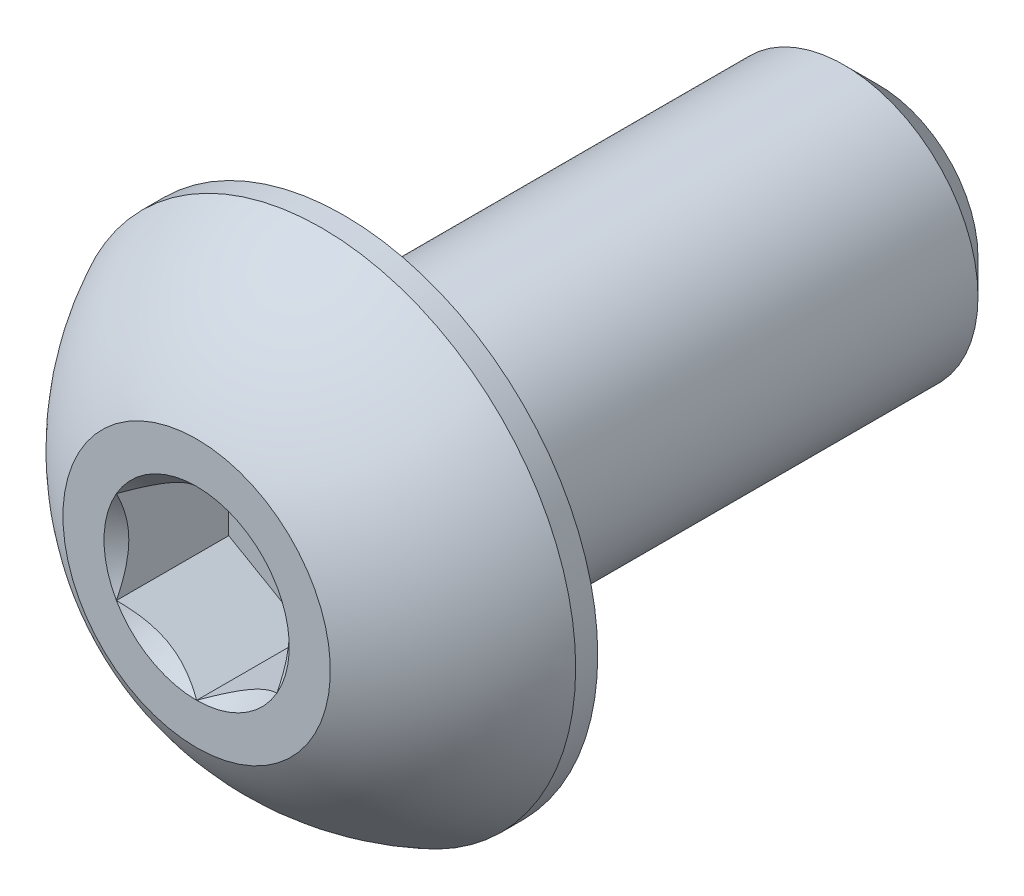
ISO-10303-21;
HEADER;
FILE_DESCRIPTION(('STEP AP214'),'2;1');
FILE_NAME('part.step','',(''),(''),'','','');
FILE_SCHEMA(('AUTOMOTIVE_DESIGN { 1 0 10303 214 1 1 1 1 }'));
ENDSEC;
DATA;
#1=APPLICATION_CONTEXT('core data for automotive mechanical design processes');
#2=APPLICATION_PROTOCOL_DEFINITION('international standard','automotive_design',2000,#1);
#3=PRODUCT_CONTEXT('',#1,'mechanical');
#4=PRODUCT('Part','Part','',(#3));
#5=PRODUCT_RELATED_PRODUCT_CATEGORY('part','',(#4));
#6=PRODUCT_DEFINITION_FORMATION('','',#4);
#7=PRODUCT_DEFINITION_CONTEXT('part definition',#1,'design');
#8=PRODUCT_DEFINITION('design','',#6,#7);
#9=PRODUCT_DEFINITION_SHAPE('','',#8);
#10=(LENGTH_UNIT() NAMED_UNIT(*) SI_UNIT(.MILLI.,.METRE.));
#11=(NAMED_UNIT(*) PLANE_ANGLE_UNIT() SI_UNIT($,.RADIAN.));
#12=(NAMED_UNIT(*) SI_UNIT($,.STERADIAN.) SOLID_ANGLE_UNIT());
#13=UNCERTAINTY_MEASURE_WITH_UNIT(LENGTH_MEASURE(1.E-05),#10,'distance_accuracy_value','');
#14=(GEOMETRIC_REPRESENTATION_CONTEXT(3) GLOBAL_UNCERTAINTY_ASSIGNED_CONTEXT((#13)) GLOBAL_UNIT_ASSIGNED_CONTEXT((#10,
#11,#12)) REPRESENTATION_CONTEXT('',''));
#15=CARTESIAN_POINT('',(0.,0.,0.));
#16=DIRECTION('',(0.,0.,1.));
#17=DIRECTION('',(1.,0.,0.));
#18=AXIS2_PLACEMENT_3D('',#15,#16,#17);
#19=CARTESIAN_POINT('',(0.,0.,6.375));
#20=DIRECTION('',(0.,0.,-1.));
#21=DIRECTION('',(-1.,0.,0.));
#22=AXIS2_PLACEMENT_3D('',#19,#20,#21);
#23=PLANE('',#22);
#24=CARTESIAN_POINT('',(0.,0.,6.375));
#25=DIRECTION('',(0.,0.,1.));
#26=DIRECTION('',(1.,0.,0.));
#27=AXIS2_PLACEMENT_3D('',#24,#25,#26);
#28=CIRCLE('',#27,1.73205080756888);
#29=CARTESIAN_POINT('',(-1.5,0.86602540378444,6.375));
#30=VERTEX_POINT('',#29);
#31=CARTESIAN_POINT('',(-1.5,-0.866025403784439,6.375));
#32=VERTEX_POINT('',#31);
#33=EDGE_CURVE('E138',#30,#32,#28,.T.);
#34=ORIENTED_EDGE('',*,*,#33,.F.);
#35=CARTESIAN_POINT('',(0.,1.73205080756888,6.375));
#36=VERTEX_POINT('',#35);
#37=EDGE_CURVE('E108',#36,#30,#28,.T.);
#38=ORIENTED_EDGE('',*,*,#37,.F.);
#39=CARTESIAN_POINT('',(1.5,0.866025403784441,6.375));
#40=VERTEX_POINT('',#39);
#41=EDGE_CURVE('E98',#40,#36,#28,.T.);
#42=ORIENTED_EDGE('',*,*,#41,.F.);
#43=CARTESIAN_POINT('',(1.5,-0.86602540378444,6.375));
#44=VERTEX_POINT('',#43);
#45=EDGE_CURVE('E59',#44,#40,#28,.T.);
#46=ORIENTED_EDGE('',*,*,#45,.F.);
#47=CARTESIAN_POINT('',(0.,-1.73205080756888,6.375));
#48=VERTEX_POINT('',#47);
#49=EDGE_CURVE('E66',#48,#44,#28,.T.);
#50=ORIENTED_EDGE('',*,*,#49,.F.);
#51=EDGE_CURVE('E141',#32,#48,#28,.T.);
#52=ORIENTED_EDGE('',*,*,#51,.F.);
#53=EDGE_LOOP('',(#34,#38,#42,#46,#50,#52));
#54=FACE_BOUND('',#53,.T.);
#55=CARTESIAN_POINT('',(0.,0.,6.375));
#56=DIRECTION('',(0.,0.,1.));
#57=DIRECTION('',(1.,0.,0.));
#58=AXIS2_PLACEMENT_3D('',#55,#56,#57);
#59=CIRCLE('',#58,2.5);
#60=CARTESIAN_POINT('',(0.,2.5,6.375));
#61=VERTEX_POINT('',#60);
#62=EDGE_CURVE('E53',#61,#61,#59,.T.);
#63=ORIENTED_EDGE('',*,*,#62,.T.);
#64=EDGE_LOOP('',(#63));
#65=FACE_BOUND('',#64,.T.);
#66=ADVANCED_FACE('F39',(#54,#65),#23,.F.);
#67=CARTESIAN_POINT('',(0.,0.,1.71694518716577));
#68=DIRECTION('',(0.,0.,1.));
#69=DIRECTION('',(0.,1.,0.));
#70=AXIS2_PLACEMENT_3D('',#67,#68,#69);
#71=SPHERICAL_SURFACE('',#70,5.28653711226622);
#72=CARTESIAN_POINT('',(0.,0.,4.0375));
#73=DIRECTION('',(0.,0.,1.));
#74=DIRECTION('',(1.,0.,0.));
#75=AXIS2_PLACEMENT_3D('',#72,#73,#74);
#76=CIRCLE('',#75,4.75);
#77=CARTESIAN_POINT('',(0.,4.75,4.0375));
#78=VERTEX_POINT('',#77);
#79=EDGE_CURVE('E239',#78,#78,#76,.T.);
#80=CARTESIAN_POINT('',(0.,2.5,6.375));
#81=CARTESIAN_POINT('',(0.,2.53026679982017,6.35875571754439));
#82=CARTESIAN_POINT('',(0.,2.56037522904968,6.34221635879359));
#83=CARTESIAN_POINT('',(0.,2.62026400427657,6.30855394811781));
#84=CARTESIAN_POINT('',(0.,2.65004435027396,6.29143089619284));
#85=CARTESIAN_POINT('',(0.,2.70926561698583,6.25660755858496));
#86=CARTESIAN_POINT('',(0.,2.73870653770032,6.23890727290205));
#87=CARTESIAN_POINT('',(0.,2.79723777417103,6.20293620595505));
#88=CARTESIAN_POINT('',(0.,2.82632808992726,6.18466542469097));
#89=CARTESIAN_POINT('',(0.,2.88414706107589,6.14756030560732));
#90=CARTESIAN_POINT('',(0.,2.91287571646831,6.12872596778775));
#91=CARTESIAN_POINT('',(0.,2.96996045130293,6.09050089302141));
#92=CARTESIAN_POINT('',(0.,2.99831653074515,6.07111015607463));
#93=CARTESIAN_POINT('',(0.,3.05464533901891,6.03177965075515));
#94=CARTESIAN_POINT('',(0.,3.08261806785047,6.01183988238243));
#95=CARTESIAN_POINT('',(0.,3.13816954607726,5.97141889083541));
#96=CARTESIAN_POINT('',(0.,3.16574829547251,5.9509376676611));
#97=CARTESIAN_POINT('',(0.,3.22050133565615,5.90944154879096));
#98=CARTESIAN_POINT('',(0.,3.24767562644455,5.88842665309514));
#99=CARTESIAN_POINT('',(0.,3.30160942393942,5.84587117426481));
#100=CARTESIAN_POINT('',(0.,3.32836893064588,5.82433059113032));
#101=CARTESIAN_POINT('',(0.,3.38146299210494,5.78073192224629));
#102=CARTESIAN_POINT('',(0.,3.40779754685753,5.75867383649675));
#103=CARTESIAN_POINT('',(0.,3.46003169800773,5.71404854384449));
#104=CARTESIAN_POINT('',(0.,3.48593129440535,5.69148133694176));
#105=CARTESIAN_POINT('',(0.,3.53728568771641,5.64584637689649));
#106=CARTESIAN_POINT('',(0.,3.56274048462986,5.62277862375395));
#107=CARTESIAN_POINT('',(0.,3.61319560685493,5.57615133633622));
#108=CARTESIAN_POINT('',(0.,3.63819593216655,5.55259180206104));
#109=CARTESIAN_POINT('',(0.,3.68773261175691,5.50498990434842));
#110=CARTESIAN_POINT('',(0.,3.71226896603565,5.48094754091097));
#111=CARTESIAN_POINT('',(0.,3.76086838042534,5.43238912030588));
#112=CARTESIAN_POINT('',(0.,3.78493144053629,5.40787306313824));
#113=CARTESIAN_POINT('',(0.,3.83257512329416,5.35837657049534));
#114=CARTESIAN_POINT('',(0.,3.85615574594108,5.33339613502008));
#115=CARTESIAN_POINT('',(0.,3.90282559378753,5.2829803776354));
#116=CARTESIAN_POINT('',(0.,3.92591481898706,5.25754505572598));
#117=CARTESIAN_POINT('',(0.,3.97159309867276,5.2062291901907));
#118=CARTESIAN_POINT('',(0.,3.99418215315894,5.18034864656483));
#119=CARTESIAN_POINT('',(0.,4.03885150820303,5.12815217148626));
#120=CARTESIAN_POINT('',(0.,4.06093180876093,5.10183624003357));
#121=CARTESIAN_POINT('',(0.,4.10457526604591,5.04877898862629));
#122=CARTESIAN_POINT('',(0.,4.12613842277298,5.0220376686717));
#123=CARTESIAN_POINT('',(0.,4.16873939899417,4.96813980122146));
#124=CARTESIAN_POINT('',(0.,4.1897772184883,4.9409832537258));
#125=CARTESIAN_POINT('',(0.,4.23131952645464,4.886265249929));
#126=CARTESIAN_POINT('',(0.,4.25182401492686,4.85870379362786));
#127=CARTESIAN_POINT('',(0.,4.29229186971308,4.8031864448106));
#128=CARTESIAN_POINT('',(0.,4.31225523602708,4.77523055229449));
#129=CARTESIAN_POINT('',(0.,4.35163326096594,4.71893495350959));
#130=CARTESIAN_POINT('',(0.,4.3710479195908,4.6905952472408));
#131=CARTESIAN_POINT('',(0.,4.40932115213664,4.63354278926291));
#132=CARTESIAN_POINT('',(0.,4.42817972605762,4.60483003755382));
#133=CARTESIAN_POINT('',(0.,4.46533362339398,4.54704239871168));
#134=CARTESIAN_POINT('',(0.,4.48362894680934,4.51796751157864));
#135=CARTESIAN_POINT('',(0.,4.51964939166499,4.45946664966675));
#136=CARTESIAN_POINT('',(0.,4.53737451310527,4.43004067488791));
#137=CARTESIAN_POINT('',(0.,4.57224781803529,4.37084881826763));
#138=CARTESIAN_POINT('',(0.,4.58939600152503,4.34108293642618));
#139=CARTESIAN_POINT('',(0.,4.62310891815402,4.28122257765293));
#140=CARTESIAN_POINT('',(0.,4.63967365129327,4.25112810072113));
#141=CARTESIAN_POINT('',(0.,4.67221336026297,4.19062198025982));
#142=CARTESIAN_POINT('',(0.,4.68818833609342,4.16021033673031));
#143=CARTESIAN_POINT('',(0.,4.71954250823692,4.09908146319351));
#144=CARTESIAN_POINT('',(0.,4.73492170454996,4.06836423318622));
#145=CARTESIAN_POINT('',(0.,4.75,4.0375));
#146=B_SPLINE_CURVE_WITH_KNOTS('',3,(#80,#81,#82,#83,#84,#85,#86,#87,#88,#89,#90,#91,#92,#93,
#94,#95,#96,#97,#98,#99,#100,#101,#102,#103,#104,#105,#106,#107,#108,#109,#110,#111,#112,#113,
#114,#115,#116,#117,#118,#119,#120,#121,#122,#123,#124,#125,#126,#127,#128,#129,#130,#131,#132,
#133,#134,#135,#136,#137,#138,#139,#140,#141,#142,#143,#144,#145),.UNSPECIFIED.,.F.,.F.,(4,2,2,
2,2,2,2,2,2,2,2,2,2,2,2,2,2,2,2,2,2,2,2,2,2,2,2,2,2,2,2,2,4),(0.,0.10304982363783,
0.206099647275661,0.309149470913491,0.412199294551323,0.515249118189152,0.618298941826983,
0.721348765464813,0.824398589102643,0.927448412740474,1.0304982363783,1.13354806001613,
1.23659788365396,1.3396477072918,1.44269753092963,1.54574735456746,1.64879717820529,
1.75184700184312,1.85489682548095,1.95794664911878,2.06099647275661,2.16404629639444,
2.26709612003227,2.3701459436701,2.47319576730793,2.57624559094576,2.67929541458359,
2.78234523822142,2.88539506185925,2.98844488549708,3.09149470913491,3.19454453277274,
3.29759435641057),.UNSPECIFIED.);
#147=EDGE_CURVE('BSEAM246',#61,#78,#146,.T.);
#148=ORIENTED_EDGE('',*,*,#62,.F.);
#149=ORIENTED_EDGE('',*,*,#79,.T.);
#150=ORIENTED_EDGE('',*,*,#147,.T.);
#151=ORIENTED_EDGE('',*,*,#147,.F.);
#152=EDGE_LOOP('',(#148,#150,#149,#151));
#153=FACE_BOUND('',#152,.T.);
#154=ADVANCED_FACE('F246',(#153),#71,.T.);
#155=CARTESIAN_POINT('',(0.,0.,6.375));
#156=DIRECTION('',(0.,0.,1.));
#157=DIRECTION('',(1.,0.,0.));
#158=AXIS2_PLACEMENT_3D('',#155,#156,#157);
#159=CYLINDRICAL_SURFACE('',#158,4.75);
#160=ORIENTED_EDGE('',*,*,#79,.F.);
#161=EDGE_LOOP('',(#160));
#162=FACE_BOUND('',#161,.T.);
#163=CARTESIAN_POINT('',(0.,0.,3.625));
#164=DIRECTION('',(0.,0.,1.));
#165=DIRECTION('',(1.,0.,0.));
#166=AXIS2_PLACEMENT_3D('',#163,#164,#165);
#167=CIRCLE('',#166,4.75);
#168=CARTESIAN_POINT('',(4.75,0.,3.625));
#169=VERTEX_POINT('',#168);
#170=EDGE_CURVE('E235',#169,#169,#167,.T.);
#171=ORIENTED_EDGE('',*,*,#170,.T.);
#172=EDGE_LOOP('',(#171));
#173=FACE_BOUND('',#172,.T.);
#174=ADVANCED_FACE('F249',(#162,#173),#159,.T.);
#175=CARTESIAN_POINT('',(0.,2.5,3.625));
#176=DIRECTION('',(0.,0.,1.));
#177=DIRECTION('',(1.,0.,0.));
#178=AXIS2_PLACEMENT_3D('',#175,#176,#177);
#179=PLANE('',#178);
#180=ORIENTED_EDGE('',*,*,#170,.F.);
#181=EDGE_LOOP('',(#180));
#182=FACE_BOUND('',#181,.T.);
#183=CARTESIAN_POINT('',(0.,0.,3.625));
#184=DIRECTION('',(0.,0.,1.));
#185=DIRECTION('',(1.,0.,0.));
#186=AXIS2_PLACEMENT_3D('',#183,#184,#185);
#187=CIRCLE('',#186,2.5);
#188=CARTESIAN_POINT('',(2.5,0.,3.625));
#189=VERTEX_POINT('',#188);
#190=EDGE_CURVE('E231',#189,#189,#187,.T.);
#191=ORIENTED_EDGE('',*,*,#190,.T.);
#192=EDGE_LOOP('',(#191));
#193=FACE_BOUND('',#192,.T.);
#194=ADVANCED_FACE('F254',(#182,#193),#179,.F.);
#195=CARTESIAN_POINT('',(0.,0.,6.375));
#196=DIRECTION('',(0.,0.,1.));
#197=DIRECTION('',(1.,0.,0.));
#198=AXIS2_PLACEMENT_3D('',#195,#196,#197);
#199=CYLINDRICAL_SURFACE('',#198,2.5);
#200=ORIENTED_EDGE('',*,*,#190,.F.);
#201=EDGE_LOOP('',(#200));
#202=FACE_BOUND('',#201,.T.);
#203=CARTESIAN_POINT('',(0.,0.,-5.735));
#204=DIRECTION('',(0.,0.,1.));
#205=DIRECTION('',(1.,0.,0.));
#206=AXIS2_PLACEMENT_3D('',#203,#204,#205);
#207=CIRCLE('',#206,2.5);
#208=CARTESIAN_POINT('',(2.5,0.,-5.735));
#209=VERTEX_POINT('',#208);
#210=EDGE_CURVE('E227',#209,#209,#207,.T.);
#211=ORIENTED_EDGE('',*,*,#210,.T.);
#212=EDGE_LOOP('',(#211));
#213=FACE_BOUND('',#212,.T.);
#214=ADVANCED_FACE('F260',(#202,#213),#199,.T.);
#215=CARTESIAN_POINT('',(0.,0.,-6.375));
#216=DIRECTION('',(0.,0.,1.));
#217=DIRECTION('',(1.,0.,0.));
#218=AXIS2_PLACEMENT_3D('',#215,#216,#217);
#219=CONICAL_SURFACE('',#218,1.86,0.785398163397443);
#220=ORIENTED_EDGE('',*,*,#210,.F.);
#221=EDGE_LOOP('',(#220));
#222=FACE_BOUND('',#221,.T.);
#223=CARTESIAN_POINT('',(0.,0.,-6.375));
#224=DIRECTION('',(0.,0.,1.));
#225=DIRECTION('',(1.,0.,0.));
#226=AXIS2_PLACEMENT_3D('',#223,#224,#225);
#227=CIRCLE('',#226,1.86);
#228=CARTESIAN_POINT('',(1.86,0.,-6.375));
#229=VERTEX_POINT('',#228);
#230=EDGE_CURVE('E209',#229,#229,#227,.T.);
#231=ORIENTED_EDGE('',*,*,#230,.T.);
#232=EDGE_LOOP('',(#231));
#233=FACE_BOUND('',#232,.T.);
#234=ADVANCED_FACE('F266',(#222,#233),#219,.T.);
#235=CARTESIAN_POINT('',(0.,0.,-6.375));
#236=DIRECTION('',(0.,0.,1.));
#237=DIRECTION('',(1.,0.,0.));
#238=AXIS2_PLACEMENT_3D('',#235,#236,#237);
#239=PLANE('',#238);
#240=ORIENTED_EDGE('',*,*,#230,.F.);
#241=EDGE_LOOP('',(#240));
#242=FACE_BOUND('',#241,.T.);
#243=ADVANCED_FACE('F175',(#242),#239,.F.);
#244=CARTESIAN_POINT('',(0.,0.,6.375));
#245=DIRECTION('',(0.,0.,1.));
#246=DIRECTION('',(1.,0.,0.));
#247=AXIS2_PLACEMENT_3D('',#244,#245,#246);
#248=CONICAL_SURFACE('',#247,1.73205080756888,0.78539816339745);
#249=ORIENTED_EDGE('',*,*,#37,.T.);
#250=CARTESIAN_POINT('',(0.000200000000000299,1.73216627762272,6.37511548160007));
#251=CARTESIAN_POINT('',(-0.0513677907370754,1.70239359975915,6.34536547606733));
#252=CARTESIAN_POINT('',(-0.103797917665201,1.67212305186355,6.31736248391031));
#253=CARTESIAN_POINT('',(-0.210709034055597,1.61039789003619,6.26608923044014));
#254=CARTESIAN_POINT('',(-0.265200195814661,1.57893740312614,6.24284750504437));
#255=CARTESIAN_POINT('',(-0.375079081357249,1.51549879897987,6.20303372899222));
#256=CARTESIAN_POINT('',(-0.4304388090952,1.4835368452681,6.18636158567089));
#257=CARTESIAN_POINT('',(-0.542377257477151,1.41890915196211,6.1606744568181));
#258=CARTESIAN_POINT('',(-0.598952556553009,1.38624538781118,6.15164029047886));
#259=CARTESIAN_POINT('',(-0.696455389516442,1.329952100953,6.14348908122685));
#260=CARTESIAN_POINT('',(-0.737256908280467,1.30639533311124,6.14228225298922));
#261=CARTESIAN_POINT('',(-0.818787969615859,1.25932335290193,6.14431405716227));
#262=CARTESIAN_POINT('',(-0.859517494314631,1.23580815085313,6.14755367074831));
#263=CARTESIAN_POINT('',(-0.940584402163417,1.18900414978427,6.15829198598196));
#264=CARTESIAN_POINT('',(-0.980921384598289,1.1657155821172,6.16579465301873));
#265=CARTESIAN_POINT('',(-1.06091833691403,1.11952932016335,6.18465161192829));
#266=CARTESIAN_POINT('',(-1.10057800851621,1.09663179808786,6.19600755701858));
#267=CARTESIAN_POINT('',(-1.20216313477449,1.03798159809698,6.22972164759267));
#268=CARTESIAN_POINT('',(-1.26345855370969,1.00259267147465,6.25462184909337));
#269=CARTESIAN_POINT('',(-1.35358562846331,0.950557780604375,6.29665665327158));
#270=CARTESIAN_POINT('',(-1.38328513990772,0.933410759677148,6.3114251535591));
#271=CARTESIAN_POINT('',(-1.44213790138375,0.899432101996408,6.34231056594017));
#272=CARTESIAN_POINT('',(-1.47129140422064,0.882600319285711,6.35842683412171));
#273=CARTESIAN_POINT('',(-1.5002,0.865909933730602,6.37511548160007));
#274=B_SPLINE_CURVE_WITH_KNOTS('',3,(#250,#251,#252,#253,#254,#255,#256,#257,#258,#259,#260,
#261,#262,#263,#264,#265,#266,#267,#268,#269,#270,#271,#272,#273),.UNSPECIFIED.,.F.,.F.,(4,2,2,
2,2,2,2,2,2,2,2,4),(0.,0.199829143693306,0.400822987382389,0.598623720538182,0.795926240188891,
0.937113067959883,1.07833105577193,1.21968061668222,1.36109089931055,1.58570969637566,
1.69770705470964,1.80965120737194),.UNSPECIFIED.);
#275=EDGE_CURVE('E11',#36,#30,#274,.T.);
#276=ORIENTED_EDGE('',*,*,#275,.F.);
#277=EDGE_LOOP('',(#249,#276));
#278=FACE_BOUND('',#277,.T.);
#279=ADVANCED_FACE('F112',(#278),#248,.F.);
#280=ORIENTED_EDGE('',*,*,#33,.T.);
#281=CARTESIAN_POINT('',(-1.5,-1.72720812994822,6.93057851646052));
#282=CARTESIAN_POINT('',(-1.5,-1.68515175723692,6.89882990803985));
#283=CARTESIAN_POINT('',(-1.5,-1.64286104772391,6.86739259398251));
#284=CARTESIAN_POINT('',(-1.5,-1.55771581058237,6.80526908771699));
#285=CARTESIAN_POINT('',(-1.5,-1.51486114408249,6.77458308604553));
#286=CARTESIAN_POINT('',(-1.5,-1.38468134170665,6.68340719255858));
#287=CARTESIAN_POINT('',(-1.5,-1.29637976089561,6.62428834354366));
#288=CARTESIAN_POINT('',(-1.5,-1.11121478745132,6.50823099640348));
#289=CARTESIAN_POINT('',(-1.5,-1.01415038251067,6.45160955880473));
#290=CARTESIAN_POINT('',(-1.5,-0.815173408989814,6.34803688130909));
#291=CARTESIAN_POINT('',(-1.5,-0.71327866932636,6.30105304157206));
#292=CARTESIAN_POINT('',(-1.5,-0.56033377500179,6.24357266845154));
#293=CARTESIAN_POINT('',(-1.5,-0.511547983012749,6.22707538777834));
#294=CARTESIAN_POINT('',(-1.5,-0.412798620213828,6.19799751294763));
#295=CARTESIAN_POINT('',(-1.5,-0.362834968520751,6.1854171886138));
#296=CARTESIAN_POINT('',(-1.5,-0.262863235540417,6.16503619416345));
#297=CARTESIAN_POINT('',(-1.5,-0.212872113909475,6.15715363276045));
#298=CARTESIAN_POINT('',(-1.5,-0.112355243682832,6.14632206397768));
#299=CARTESIAN_POINT('',(-1.5,-0.0618295884917315,6.14337220852945));
#300=CARTESIAN_POINT('',(-1.5,0.0374291732025488,6.14262485772178));
#301=CARTESIAN_POINT('',(-1.5,0.0861609670655336,6.14464473355048));
#302=CARTESIAN_POINT('',(-1.5,0.183206937624694,6.15332255287941));
#303=CARTESIAN_POINT('',(-1.5,0.2315210732897,6.15998094694588));
#304=CARTESIAN_POINT('',(-1.5,0.328199853268108,6.17768524408904));
#305=CARTESIAN_POINT('',(-1.5,0.376550616148691,6.18880581121774));
#306=CARTESIAN_POINT('',(-1.5,0.47219569695576,6.21484341399777));
#307=CARTESIAN_POINT('',(-1.5,0.519490102919009,6.2297601319841));
#308=CARTESIAN_POINT('',(-1.5,0.668391282485063,6.28233522351147));
#309=CARTESIAN_POINT('',(-1.5,0.76787870926495,6.32598128736184));
#310=CARTESIAN_POINT('',(-1.5,0.9621798663855,6.42302299442906));
#311=CARTESIAN_POINT('',(-1.5,1.05697519927965,6.47645366489712));
#312=CARTESIAN_POINT('',(-1.5,1.23814273494588,6.58668585175783));
#313=CARTESIAN_POINT('',(-1.5,1.32469942140117,6.64318792042618));
#314=CARTESIAN_POINT('',(-1.5,1.45222331245985,6.73053430126784));
#315=CARTESIAN_POINT('',(-1.5,1.49418091932912,6.75995775835653));
#316=CARTESIAN_POINT('',(-1.5,1.5775227288333,6.81958282148156));
#317=CARTESIAN_POINT('',(-1.5,1.6189070859806,6.84978421130285));
#318=CARTESIAN_POINT('',(-1.5,1.66005277969054,6.88030817823521));
#319=B_SPLINE_CURVE_WITH_KNOTS('',3,(#281,#282,#283,#284,#285,#286,#287,#288,#289,#290,#291,
#292,#293,#294,#295,#296,#297,#298,#299,#300,#301,#302,#303,#304,#305,#306,#307,#308,#309,#310,
#311,#312,#313,#314,#315,#316,#317,#318),.UNSPECIFIED.,.F.,.F.,(4,2,2,2,2,2,2,2,2,2,2,2,2,2,2,2,
2,2,4),(0.,0.158079549012758,0.316198781054129,0.634850417468465,0.97169031155178,
1.30737131686505,1.46173961151183,1.61611853763032,1.76772101442095,1.91929742387554,
2.06538741227088,2.21149159321503,2.36014984648184,2.50879566399376,2.83376031423511,
3.15991186974582,3.4698560178094,3.62358896013691,3.77727962610764),.UNSPECIFIED.);
#320=EDGE_CURVE('E107',#30,#32,#319,.F.);
#321=ORIENTED_EDGE('',*,*,#320,.F.);
#322=EDGE_LOOP('',(#280,#321));
#323=FACE_BOUND('',#322,.T.);
#324=ADVANCED_FACE('F278',(#323),#248,.F.);
#325=ORIENTED_EDGE('',*,*,#51,.T.);
#326=CARTESIAN_POINT('',(-1.5002,-0.8659099337306,6.37511548160007));
#327=CARTESIAN_POINT('',(-1.44863220926292,-0.895682611594165,6.34536547606733));
#328=CARTESIAN_POINT('',(-1.3962020823348,-0.925953159489764,6.31736248391031));
#329=CARTESIAN_POINT('',(-1.2892909659444,-0.987678321317123,6.26608923044014));
#330=CARTESIAN_POINT('',(-1.23479980418534,-1.01913880822717,6.24284750504437));
#331=CARTESIAN_POINT('',(-1.12492091864275,-1.08257741237344,6.20303372899222));
#332=CARTESIAN_POINT('',(-1.0695611909048,-1.11453936608521,6.18636158567089));
#333=CARTESIAN_POINT('',(-0.957622742522849,-1.1791670593912,6.1606744568181));
#334=CARTESIAN_POINT('',(-0.901047443446992,-1.21183082354213,6.15164029047886));
#335=CARTESIAN_POINT('',(-0.80354461048356,-1.26812411040032,6.14348908122685));
#336=CARTESIAN_POINT('',(-0.762743091719534,-1.29168087824208,6.14228225298921));
#337=CARTESIAN_POINT('',(-0.681212030384142,-1.33875285845138,6.14431405716226));
#338=CARTESIAN_POINT('',(-0.640482505685371,-1.36226806050018,6.14755367074831));
#339=CARTESIAN_POINT('',(-0.559415597836585,-1.40907206156905,6.15829198598196));
#340=CARTESIAN_POINT('',(-0.519078615401713,-1.43236062923612,6.16579465301873));
#341=CARTESIAN_POINT('',(-0.43908166308597,-1.47854689118996,6.18465161192829));
#342=CARTESIAN_POINT('',(-0.399421991483793,-1.50144441326545,6.19600755701858));
#343=CARTESIAN_POINT('',(-0.297836865225516,-1.56009461325633,6.22972164759267));
#344=CARTESIAN_POINT('',(-0.236541446290311,-1.59548353987866,6.25462184909336));
#345=CARTESIAN_POINT('',(-0.146414371536687,-1.64751843074894,6.29665665327157));
#346=CARTESIAN_POINT('',(-0.116714860092283,-1.66466545167617,6.31142515355909));
#347=CARTESIAN_POINT('',(-0.0578620986162496,-1.69864410935691,6.34231056594017));
#348=CARTESIAN_POINT('',(-0.028708595779363,-1.71547589206761,6.35842683412171));
#349=CARTESIAN_POINT('',(0.000199999999999991,-1.73216627762271,6.37511548160007));
#350=B_SPLINE_CURVE_WITH_KNOTS('',3,(#326,#327,#328,#329,#330,#331,#332,#333,#334,#335,#336,
#337,#338,#339,#340,#341,#342,#343,#344,#345,#346,#347,#348,#349),.UNSPECIFIED.,.F.,.F.,(4,2,2,
2,2,2,2,2,2,2,2,4),(0.,0.199829143693304,0.400822987382389,0.598623720538181,0.795926240188889,
0.937113067959881,1.07833105577193,1.21968061668222,1.36109089931054,1.58570969637565,
1.69770705470964,1.80965120737194),.UNSPECIFIED.);
#351=EDGE_CURVE('E151',#32,#48,#350,.T.);
#352=ORIENTED_EDGE('',*,*,#351,.F.);
#353=EDGE_LOOP('',(#325,#352));
#354=FACE_BOUND('',#353,.T.);
#355=ADVANCED_FACE('F386',(#354),#248,.F.);
#356=ORIENTED_EDGE('',*,*,#49,.T.);
#357=CARTESIAN_POINT('',(-0.000200000000000083,-1.73216627762271,6.37511548160007));
#358=CARTESIAN_POINT('',(0.0513677907370757,-1.70239359975915,6.34536547606733));
#359=CARTESIAN_POINT('',(0.103797917665201,-1.67212305186355,6.31736248391031));
#360=CARTESIAN_POINT('',(0.210709034055596,-1.61039789003619,6.26608923044014));
#361=CARTESIAN_POINT('',(0.265200195814661,-1.57893740312614,6.24284750504437));
#362=CARTESIAN_POINT('',(0.375079081357248,-1.51549879897987,6.20303372899222));
#363=CARTESIAN_POINT('',(0.4304388090952,-1.4835368452681,6.18636158567089));
#364=CARTESIAN_POINT('',(0.542377257477151,-1.41890915196211,6.1606744568181));
#365=CARTESIAN_POINT('',(0.598952556553009,-1.38624538781118,6.15164029047886));
#366=CARTESIAN_POINT('',(0.696455389516441,-1.32995210095299,6.14348908122685));
#367=CARTESIAN_POINT('',(0.737256908280466,-1.30639533311124,6.14228225298922));
#368=CARTESIAN_POINT('',(0.818787969615858,-1.25932335290193,6.14431405716227));
#369=CARTESIAN_POINT('',(0.85951749431463,-1.23580815085313,6.14755367074831));
#370=CARTESIAN_POINT('',(0.940584402163416,-1.18900414978427,6.15829198598196));
#371=CARTESIAN_POINT('',(0.980921384598288,-1.1657155821172,6.16579465301873));
#372=CARTESIAN_POINT('',(1.06091833691403,-1.11952932016335,6.18465161192829));
#373=CARTESIAN_POINT('',(1.10057800851621,-1.09663179808786,6.19600755701858));
#374=CARTESIAN_POINT('',(1.20216313477448,-1.03798159809698,6.22972164759267));
#375=CARTESIAN_POINT('',(1.26345855370969,-1.00259267147465,6.25462184909337));
#376=CARTESIAN_POINT('',(1.35358562846331,-0.950557780604375,6.29665665327157));
#377=CARTESIAN_POINT('',(1.38328513990772,-0.933410759677148,6.31142515355909));
#378=CARTESIAN_POINT('',(1.44213790138375,-0.899432101996407,6.34231056594017));
#379=CARTESIAN_POINT('',(1.47129140422064,-0.882600319285711,6.35842683412171));
#380=CARTESIAN_POINT('',(1.5002,-0.865909933730601,6.37511548160007));
#381=B_SPLINE_CURVE_WITH_KNOTS('',3,(#357,#358,#359,#360,#361,#362,#363,#364,#365,#366,#367,
#368,#369,#370,#371,#372,#373,#374,#375,#376,#377,#378,#379,#380),.UNSPECIFIED.,.F.,.F.,(4,2,2,
2,2,2,2,2,2,2,2,4),(0.,0.199829143693305,0.400822987382388,0.598623720538181,0.795926240188889,
0.937113067959881,1.07833105577193,1.21968061668222,1.36109089931054,1.58570969637565,
1.69770705470964,1.80965120737194),.UNSPECIFIED.);
#382=EDGE_CURVE('E369',#48,#44,#381,.T.);
#383=ORIENTED_EDGE('',*,*,#382,.F.);
#384=EDGE_LOOP('',(#356,#383));
#385=FACE_BOUND('',#384,.T.);
#386=ADVANCED_FACE('F387',(#385),#248,.F.);
#387=ORIENTED_EDGE('',*,*,#45,.T.);
#388=CARTESIAN_POINT('',(1.5,-1.72720812969693,6.93057851627079));
#389=CARTESIAN_POINT('',(1.5,-1.68515175699268,6.89882990785742));
#390=CARTESIAN_POINT('',(1.5,-1.64286104748674,6.86739259380738));
#391=CARTESIAN_POINT('',(1.5,-1.55771581035942,6.80526908755641));
#392=CARTESIAN_POINT('',(1.5,-1.51486114386668,6.7745830858922));
#393=CARTESIAN_POINT('',(1.5,-1.3846813415127,6.68340719242716));
#394=CARTESIAN_POINT('',(1.5,-1.29637976071654,6.62428834342677));
#395=CARTESIAN_POINT('',(1.5,-1.11121478730467,6.5082309963165));
#396=CARTESIAN_POINT('',(1.5,-1.01415038238167,6.45160955873301));
#397=CARTESIAN_POINT('',(1.5,-0.815173408897606,6.34803688126565));
#398=CARTESIAN_POINT('',(1.5,-0.713278669253286,6.30105304154167));
#399=CARTESIAN_POINT('',(1.5,-0.560333774943112,6.24357266843083));
#400=CARTESIAN_POINT('',(1.5,-0.511547982948043,6.22707538775725));
#401=CARTESIAN_POINT('',(1.5,-0.412798620136867,6.197997512927));
#402=CARTESIAN_POINT('',(1.5,-0.362834968437563,6.18541718859402));
#403=CARTESIAN_POINT('',(1.5,-0.262863235444982,6.16503619414677));
#404=CARTESIAN_POINT('',(1.5,-0.212872113808023,6.15715363274598));
#405=CARTESIAN_POINT('',(1.5,-0.112355243569546,6.146322063969));
#406=CARTESIAN_POINT('',(1.5,-0.0618295883726284,6.14337220852435));
#407=CARTESIAN_POINT('',(1.5,0.0374291733323834,6.14262485772485));
#408=CARTESIAN_POINT('',(1.5,0.0861609672002981,6.14464473355807));
#409=CARTESIAN_POINT('',(1.5,0.183206937768826,6.15332255289676));
#410=CARTESIAN_POINT('',(1.5,0.231521073438268,6.15998094696845));
#411=CARTESIAN_POINT('',(1.5,0.328199853425435,6.17768524412257));
#412=CARTESIAN_POINT('',(1.5,0.376550616310327,6.18880581125704));
#413=CARTESIAN_POINT('',(1.5,0.472195697125598,6.21484341404871));
#414=CARTESIAN_POINT('',(1.5,0.51949010309274,6.22976013204093));
#415=CARTESIAN_POINT('',(1.5,0.668391282696624,6.28233522359607));
#416=CARTESIAN_POINT('',(1.5,0.767878709508552,6.32598128747197));
#417=CARTESIAN_POINT('',(1.5,0.962179866690723,6.42302299459309));
#418=CARTESIAN_POINT('',(1.5,1.05697519961444,6.47645366508953));
#419=CARTESIAN_POINT('',(1.5,1.23814273533383,6.58668585200456));
#420=CARTESIAN_POINT('',(1.5,1.3246994218129,6.64318792069859));
#421=CARTESIAN_POINT('',(1.5,1.45222331290673,6.73053430157866));
#422=CARTESIAN_POINT('',(1.5,1.49418091978756,6.75995775868004));
#423=CARTESIAN_POINT('',(1.5,1.57752272931476,6.81958282183046));
#424=CARTESIAN_POINT('',(1.5,1.61890708647354,6.84978421166443));
#425=CARTESIAN_POINT('',(1.5,1.66005278019494,6.88030817860945));
#426=B_SPLINE_CURVE_WITH_KNOTS('',3,(#388,#389,#390,#391,#392,#393,#394,#395,#396,#397,#398,
#399,#400,#401,#402,#403,#404,#405,#406,#407,#408,#409,#410,#411,#412,#413,#414,#415,#416,#417,
#418,#419,#420,#421,#422,#423,#424,#425),.UNSPECIFIED.,.F.,.F.,(4,2,2,2,2,2,2,2,2,2,2,2,2,2,2,2,
2,2,4),(0.,0.158079548982668,0.316198780993942,0.634850417346959,0.97169031136151,
1.30737131660667,1.46173961127089,1.61611853740677,1.7677210142141,1.91929742368538,
2.065387412096,2.21149159305544,2.36014984633872,2.5087956638671,2.83376031422673,
3.15991186985652,3.46985601802197,3.62358896039974,3.7772796264207),.UNSPECIFIED.);
#427=EDGE_CURVE('E125',#44,#40,#426,.T.);
#428=ORIENTED_EDGE('',*,*,#427,.F.);
#429=EDGE_LOOP('',(#387,#428));
#430=FACE_BOUND('',#429,.T.);
#431=ADVANCED_FACE('F389',(#430),#248,.F.);
#432=ORIENTED_EDGE('',*,*,#41,.T.);
#433=CARTESIAN_POINT('',(1.5002,0.865909933730602,6.37511548160007));
#434=CARTESIAN_POINT('',(1.44863220926292,0.895682611594167,6.34536547606733));
#435=CARTESIAN_POINT('',(1.3962020823348,0.925953159489766,6.31736248391031));
#436=CARTESIAN_POINT('',(1.2892909659444,0.987678321317125,6.26608923044014));
#437=CARTESIAN_POINT('',(1.23479980418534,1.01913880822718,6.24284750504437));
#438=CARTESIAN_POINT('',(1.12492091864275,1.08257741237345,6.20303372899222));
#439=CARTESIAN_POINT('',(1.0695611909048,1.11453936608522,6.18636158567089));
#440=CARTESIAN_POINT('',(0.95762274252285,1.1791670593912,6.1606744568181));
#441=CARTESIAN_POINT('',(0.901047443446992,1.21183082354213,6.15164029047886));
#442=CARTESIAN_POINT('',(0.80354461048356,1.26812411040032,6.14348908122685));
#443=CARTESIAN_POINT('',(0.762743091719535,1.29168087824208,6.14228225298922));
#444=CARTESIAN_POINT('',(0.681212030384143,1.33875285845138,6.14431405716227));
#445=CARTESIAN_POINT('',(0.640482505685371,1.36226806050018,6.14755367074831));
#446=CARTESIAN_POINT('',(0.559415597836585,1.40907206156905,6.15829198598196));
#447=CARTESIAN_POINT('',(0.519078615401713,1.43236062923612,6.16579465301873));
#448=CARTESIAN_POINT('',(0.43908166308597,1.47854689118997,6.18465161192829));
#449=CARTESIAN_POINT('',(0.399421991483793,1.50144441326545,6.19600755701858));
#450=CARTESIAN_POINT('',(0.297836865225516,1.56009461325633,6.22972164759267));
#451=CARTESIAN_POINT('',(0.236541446290311,1.59548353987866,6.25462184909337));
#452=CARTESIAN_POINT('',(0.146414371536687,1.64751843074894,6.29665665327158));
#453=CARTESIAN_POINT('',(0.116714860092283,1.66466545167617,6.3114251535591));
#454=CARTESIAN_POINT('',(0.0578620986162494,1.69864410935691,6.34231056594017));
#455=CARTESIAN_POINT('',(0.0287085957793633,1.71547589206761,6.35842683412171));
#456=CARTESIAN_POINT('',(-0.000199999999999678,1.73216627762272,6.37511548160007));
#457=B_SPLINE_CURVE_WITH_KNOTS('',3,(#433,#434,#435,#436,#437,#438,#439,#440,#441,#442,#443,
#444,#445,#446,#447,#448,#449,#450,#451,#452,#453,#454,#455,#456),.UNSPECIFIED.,.F.,.F.,(4,2,2,
2,2,2,2,2,2,2,2,4),(0.,0.199829143693304,0.400822987382388,0.59862372053818,0.795926240188887,
0.937113067959879,1.07833105577193,1.21968061668222,1.36109089931054,1.58570969637565,
1.69770705470964,1.80965120737194),.UNSPECIFIED.);
#458=EDGE_CURVE('E102',#40,#36,#457,.T.);
#459=ORIENTED_EDGE('',*,*,#458,.F.);
#460=EDGE_LOOP('',(#432,#459));
#461=FACE_BOUND('',#460,.T.);
#462=ADVANCED_FACE('F100',(#461),#248,.F.);
#463=CARTESIAN_POINT('',(0.,0.,4.275));
#464=DIRECTION('',(0.,0.,1.));
#465=DIRECTION('',(1.,0.,0.));
#466=AXIS2_PLACEMENT_3D('',#463,#464,#465);
#467=PLANE('',#466);
#468=DIRECTION('',(-0.866025403784439,0.5,0.));
#469=VECTOR('',#468,1.);
#470=CARTESIAN_POINT('',(1.5,0.86602540378444,4.275));
#471=LINE('',#470,#469);
#472=CARTESIAN_POINT('',(1.5,0.86602540378444,4.275));
#473=VERTEX_POINT('',#472);
#474=CARTESIAN_POINT('',(0.,1.73205080756888,4.275));
#475=VERTEX_POINT('',#474);
#476=EDGE_CURVE('E124',#473,#475,#471,.T.);
#477=ORIENTED_EDGE('',*,*,#476,.T.);
#478=DIRECTION('',(-0.866025403784439,-0.5,0.));
#479=VECTOR('',#478,1.);
#480=CARTESIAN_POINT('',(0.,1.73205080756888,4.275));
#481=LINE('',#480,#479);
#482=CARTESIAN_POINT('',(-1.5,0.86602540378444,4.275));
#483=VERTEX_POINT('',#482);
#484=EDGE_CURVE('E129',#475,#483,#481,.T.);
#485=ORIENTED_EDGE('',*,*,#484,.T.);
#486=DIRECTION('',(0.,-1.,0.));
#487=VECTOR('',#486,1.);
#488=CARTESIAN_POINT('',(-1.5,0.86602540378444,4.275));
#489=LINE('',#488,#487);
#490=CARTESIAN_POINT('',(-1.5,-0.866025403784438,4.275));
#491=VERTEX_POINT('',#490);
#492=EDGE_CURVE('E192',#483,#491,#489,.T.);
#493=ORIENTED_EDGE('',*,*,#492,.T.);
#494=DIRECTION('',(0.866025403784439,-0.5,0.));
#495=VECTOR('',#494,1.);
#496=CARTESIAN_POINT('',(-1.5,-0.866025403784438,4.275));
#497=LINE('',#496,#495);
#498=CARTESIAN_POINT('',(0.,-1.73205080756888,4.275));
#499=VERTEX_POINT('',#498);
#500=EDGE_CURVE('E196',#491,#499,#497,.T.);
#501=ORIENTED_EDGE('',*,*,#500,.T.);
#502=DIRECTION('',(0.866025403784439,0.5,0.));
#503=VECTOR('',#502,1.);
#504=CARTESIAN_POINT('',(0.,-1.73205080756888,4.275));
#505=LINE('',#504,#503);
#506=CARTESIAN_POINT('',(1.5,-0.866025403784439,4.275));
#507=VERTEX_POINT('',#506);
#508=EDGE_CURVE('E200',#499,#507,#505,.T.);
#509=ORIENTED_EDGE('',*,*,#508,.T.);
#510=DIRECTION('',(0.,1.,0.));
#511=VECTOR('',#510,1.);
#512=CARTESIAN_POINT('',(1.5,-0.866025403784439,4.275));
#513=LINE('',#512,#511);
#514=EDGE_CURVE('E133',#507,#473,#513,.T.);
#515=ORIENTED_EDGE('',*,*,#514,.T.);
#516=EDGE_LOOP('',(#477,#485,#493,#501,#509,#515));
#517=FACE_BOUND('',#516,.T.);
#518=ADVANCED_FACE('F170',(#517),#467,.T.);
#519=CARTESIAN_POINT('',(0.,1.73205080756888,4.275));
#520=DIRECTION('',(-0.5,0.866025403784439,0.));
#521=DIRECTION('',(-0.866025403784439,-0.5,0.));
#522=AXIS2_PLACEMENT_3D('',#519,#520,#521);
#523=PLANE('',#522);
#524=DIRECTION('',(0.,0.,1.));
#525=VECTOR('',#524,1.);
#526=CARTESIAN_POINT('',(0.,1.73205080756888,4.275));
#527=LINE('',#526,#525);
#528=EDGE_CURVE('E120',#475,#36,#527,.T.);
#529=ORIENTED_EDGE('',*,*,#528,.T.);
#530=ORIENTED_EDGE('',*,*,#275,.T.);
#531=DIRECTION('',(0.,0.,1.));
#532=VECTOR('',#531,1.);
#533=CARTESIAN_POINT('',(-1.5,0.86602540378444,4.275));
#534=LINE('',#533,#532);
#535=EDGE_CURVE('E132',#483,#30,#534,.T.);
#536=ORIENTED_EDGE('',*,*,#535,.F.);
#537=ORIENTED_EDGE('',*,*,#484,.F.);
#538=EDGE_LOOP('',(#529,#530,#536,#537));
#539=FACE_BOUND('',#538,.T.);
#540=ADVANCED_FACE('F127',(#539),#523,.F.);
#541=CARTESIAN_POINT('',(-1.5,0.86602540378444,4.275));
#542=DIRECTION('',(-1.,0.,0.));
#543=DIRECTION('',(0.,-1.,0.));
#544=AXIS2_PLACEMENT_3D('',#541,#542,#543);
#545=PLANE('',#544);
#546=ORIENTED_EDGE('',*,*,#535,.T.);
#547=ORIENTED_EDGE('',*,*,#320,.T.);
#548=DIRECTION('',(0.,0.,1.));
#549=VECTOR('',#548,1.);
#550=CARTESIAN_POINT('',(-1.5,-0.866025403784438,4.275));
#551=LINE('',#550,#549);
#552=EDGE_CURVE('E218',#491,#32,#551,.T.);
#553=ORIENTED_EDGE('',*,*,#552,.F.);
#554=ORIENTED_EDGE('',*,*,#492,.F.);
#555=EDGE_LOOP('',(#546,#547,#553,#554));
#556=FACE_BOUND('',#555,.T.);
#557=ADVANCED_FACE('F160',(#556),#545,.F.);
#558=CARTESIAN_POINT('',(-1.5,-0.866025403784438,4.275));
#559=DIRECTION('',(-0.5,-0.866025403784439,0.));
#560=DIRECTION('',(0.866025403784439,-0.5,0.));
#561=AXIS2_PLACEMENT_3D('',#558,#559,#560);
#562=PLANE('',#561);
#563=ORIENTED_EDGE('',*,*,#552,.T.);
#564=ORIENTED_EDGE('',*,*,#351,.T.);
#565=DIRECTION('',(0.,0.,1.));
#566=VECTOR('',#565,1.);
#567=CARTESIAN_POINT('',(0.,-1.73205080756888,4.275));
#568=LINE('',#567,#566);
#569=EDGE_CURVE('E214',#499,#48,#568,.T.);
#570=ORIENTED_EDGE('',*,*,#569,.F.);
#571=ORIENTED_EDGE('',*,*,#500,.F.);
#572=EDGE_LOOP('',(#563,#564,#570,#571));
#573=FACE_BOUND('',#572,.T.);
#574=ADVANCED_FACE('F163',(#573),#562,.F.);
#575=CARTESIAN_POINT('',(0.,-1.73205080756888,4.275));
#576=DIRECTION('',(0.5,-0.866025403784439,0.));
#577=DIRECTION('',(0.866025403784439,0.5,0.));
#578=AXIS2_PLACEMENT_3D('',#575,#576,#577);
#579=PLANE('',#578);
#580=ORIENTED_EDGE('',*,*,#569,.T.);
#581=ORIENTED_EDGE('',*,*,#382,.T.);
#582=DIRECTION('',(0.,0.,1.));
#583=VECTOR('',#582,1.);
#584=CARTESIAN_POINT('',(1.5,-0.866025403784439,4.275));
#585=LINE('',#584,#583);
#586=EDGE_CURVE('E210',#507,#44,#585,.T.);
#587=ORIENTED_EDGE('',*,*,#586,.F.);
#588=ORIENTED_EDGE('',*,*,#508,.F.);
#589=EDGE_LOOP('',(#580,#581,#587,#588));
#590=FACE_BOUND('',#589,.T.);
#591=ADVANCED_FACE('F337',(#590),#579,.F.);
#592=CARTESIAN_POINT('',(1.5,-0.866025403784439,4.275));
#593=DIRECTION('',(1.,0.,0.));
#594=DIRECTION('',(0.,1.,0.));
#595=AXIS2_PLACEMENT_3D('',#592,#593,#594);
#596=PLANE('',#595);
#597=ORIENTED_EDGE('',*,*,#586,.T.);
#598=ORIENTED_EDGE('',*,*,#427,.T.);
#599=DIRECTION('',(0.,0.,1.));
#600=VECTOR('',#599,1.);
#601=CARTESIAN_POINT('',(1.5,0.86602540378444,4.275));
#602=LINE('',#601,#600);
#603=EDGE_CURVE('E122',#473,#40,#602,.T.);
#604=ORIENTED_EDGE('',*,*,#603,.F.);
#605=ORIENTED_EDGE('',*,*,#514,.F.);
#606=EDGE_LOOP('',(#597,#598,#604,#605));
#607=FACE_BOUND('',#606,.T.);
#608=ADVANCED_FACE('F174',(#607),#596,.F.);
#609=CARTESIAN_POINT('',(1.5,0.86602540378444,4.275));
#610=DIRECTION('',(0.5,0.866025403784438,0.));
#611=DIRECTION('',(-0.866025403784439,0.5,0.));
#612=AXIS2_PLACEMENT_3D('',#609,#610,#611);
#613=PLANE('',#612);
#614=ORIENTED_EDGE('',*,*,#603,.T.);
#615=ORIENTED_EDGE('',*,*,#458,.T.);
#616=ORIENTED_EDGE('',*,*,#528,.F.);
#617=ORIENTED_EDGE('',*,*,#476,.F.);
#618=EDGE_LOOP('',(#614,#615,#616,#617));
#619=FACE_BOUND('',#618,.T.);
#620=ADVANCED_FACE('F118',(#619),#613,.F.);
#621=CLOSED_SHELL('',(#66,#154,#174,#194,#214,#234,#243,#279,#324,#355,#386,#431,#462,#518,#540,
#557,#574,#591,#608,#620));
#622=MANIFOLD_SOLID_BREP('B2',#621);
#623=ADVANCED_BREP_SHAPE_REPRESENTATION('',(#18,#622),#14);
#624=SHAPE_DEFINITION_REPRESENTATION(#9,#623);
ENDSEC;
END-ISO-10303-21;
